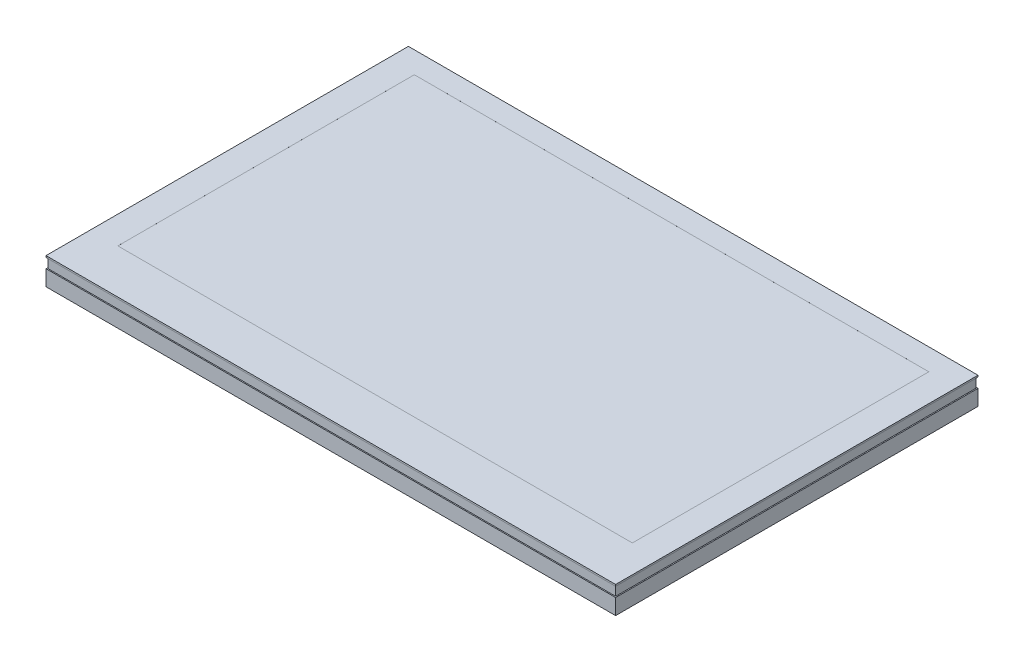
ISO-10303-21;
HEADER;
FILE_DESCRIPTION(('STEP AP214'),'2;1');
FILE_NAME('part.step','',(''),(''),'','','');
FILE_SCHEMA(('AUTOMOTIVE_DESIGN { 1 0 10303 214 1 1 1 1 }'));
ENDSEC;
DATA;
#1=APPLICATION_CONTEXT('core data for automotive mechanical design processes');
#2=APPLICATION_PROTOCOL_DEFINITION('international standard','automotive_design',2000,#1);
#3=PRODUCT_CONTEXT('',#1,'mechanical');
#4=PRODUCT('Part','Part','',(#3));
#5=PRODUCT_RELATED_PRODUCT_CATEGORY('part','',(#4));
#6=PRODUCT_DEFINITION_FORMATION('','',#4);
#7=PRODUCT_DEFINITION_CONTEXT('part definition',#1,'design');
#8=PRODUCT_DEFINITION('design','',#6,#7);
#9=PRODUCT_DEFINITION_SHAPE('','',#8);
#10=(LENGTH_UNIT() NAMED_UNIT(*) SI_UNIT(.MILLI.,.METRE.));
#11=(NAMED_UNIT(*) PLANE_ANGLE_UNIT() SI_UNIT($,.RADIAN.));
#12=(NAMED_UNIT(*) SI_UNIT($,.STERADIAN.) SOLID_ANGLE_UNIT());
#13=UNCERTAINTY_MEASURE_WITH_UNIT(LENGTH_MEASURE(1.E-05),#10,'distance_accuracy_value','');
#14=(GEOMETRIC_REPRESENTATION_CONTEXT(3) GLOBAL_UNCERTAINTY_ASSIGNED_CONTEXT((#13)) GLOBAL_UNIT_ASSIGNED_CONTEXT((#10,
#11,#12)) REPRESENTATION_CONTEXT('',''));
#15=CARTESIAN_POINT('',(0.,0.,0.));
#16=DIRECTION('',(0.,0.,1.));
#17=DIRECTION('',(1.,0.,0.));
#18=AXIS2_PLACEMENT_3D('',#15,#16,#17);
#19=CARTESIAN_POINT('',(0.,5.001,0.));
#20=DIRECTION('',(0.,1.,0.));
#21=DIRECTION('',(0.,0.,1.));
#22=AXIS2_PLACEMENT_3D('',#19,#20,#21);
#23=PLANE('',#22);
#24=DIRECTION('',(-1.,0.,0.));
#25=VECTOR('',#24,1.);
#26=CARTESIAN_POINT('',(52.71,5.001,-33.535));
#27=LINE('',#26,#25);
#28=CARTESIAN_POINT('',(52.71,5.001,-33.535));
#29=VERTEX_POINT('',#28);
#30=CARTESIAN_POINT('',(-52.71,5.001,-33.535));
#31=VERTEX_POINT('',#30);
#32=EDGE_CURVE('E153',#29,#31,#27,.T.);
#33=ORIENTED_EDGE('',*,*,#32,.T.);
#34=DIRECTION('',(0.,0.,1.));
#35=VECTOR('',#34,1.);
#36=CARTESIAN_POINT('',(-52.71,5.001,-33.535));
#37=LINE('',#36,#35);
#38=CARTESIAN_POINT('',(-52.71,5.001,33.535));
#39=VERTEX_POINT('',#38);
#40=EDGE_CURVE('E156',#31,#39,#37,.T.);
#41=ORIENTED_EDGE('',*,*,#40,.T.);
#42=DIRECTION('',(1.,0.,0.));
#43=VECTOR('',#42,1.);
#44=CARTESIAN_POINT('',(-52.71,5.001,33.535));
#45=LINE('',#44,#43);
#46=CARTESIAN_POINT('',(52.71,5.001,33.535));
#47=VERTEX_POINT('',#46);
#48=EDGE_CURVE('E159',#39,#47,#45,.T.);
#49=ORIENTED_EDGE('',*,*,#48,.T.);
#50=DIRECTION('',(0.,0.,-1.));
#51=VECTOR('',#50,1.);
#52=CARTESIAN_POINT('',(52.71,5.001,33.535));
#53=LINE('',#52,#51);
#54=EDGE_CURVE('E161',#47,#29,#53,.T.);
#55=ORIENTED_EDGE('',*,*,#54,.T.);
#56=EDGE_LOOP('',(#33,#41,#49,#55));
#57=FACE_BOUND('',#56,.T.);
#58=DIRECTION('',(0.,0.,1.));
#59=VECTOR('',#58,1.);
#60=CARTESIAN_POINT('',(-47.61,5.001,-29.535));
#61=LINE('',#60,#59);
#62=CARTESIAN_POINT('',(-47.61,5.001,-29.535));
#63=VERTEX_POINT('',#62);
#64=CARTESIAN_POINT('',(-47.61,5.001,25.335));
#65=VERTEX_POINT('',#64);
#66=EDGE_CURVE('E125',#63,#65,#61,.T.);
#67=ORIENTED_EDGE('',*,*,#66,.F.);
#68=DIRECTION('',(-1.,0.,0.));
#69=VECTOR('',#68,1.);
#70=CARTESIAN_POINT('',(47.61,5.001,-29.535));
#71=LINE('',#70,#69);
#72=CARTESIAN_POINT('',(47.61,5.001,-29.535));
#73=VERTEX_POINT('',#72);
#74=EDGE_CURVE('E117',#73,#63,#71,.T.);
#75=ORIENTED_EDGE('',*,*,#74,.F.);
#76=DIRECTION('',(0.,0.,-1.));
#77=VECTOR('',#76,1.);
#78=CARTESIAN_POINT('',(47.61,5.001,25.335));
#79=LINE('',#78,#77);
#80=CARTESIAN_POINT('',(47.61,5.001,25.335));
#81=VERTEX_POINT('',#80);
#82=EDGE_CURVE('E139',#81,#73,#79,.T.);
#83=ORIENTED_EDGE('',*,*,#82,.F.);
#84=DIRECTION('',(1.,0.,0.));
#85=VECTOR('',#84,1.);
#86=CARTESIAN_POINT('',(-47.61,5.001,25.335));
#87=LINE('',#86,#85);
#88=EDGE_CURVE('E137',#65,#81,#87,.T.);
#89=ORIENTED_EDGE('',*,*,#88,.F.);
#90=EDGE_LOOP('',(#67,#75,#83,#89));
#91=FACE_BOUND('',#90,.T.);
#92=ADVANCED_FACE('F52',(#57,#91),#23,.T.);
#93=CARTESIAN_POINT('',(0.,5.,0.));
#94=DIRECTION('',(0.,1.,0.));
#95=DIRECTION('',(0.,0.,1.));
#96=AXIS2_PLACEMENT_3D('',#93,#94,#95);
#97=PLANE('',#96);
#98=DIRECTION('',(-1.,0.,0.));
#99=VECTOR('',#98,1.);
#100=CARTESIAN_POINT('',(52.71,5.,-33.535));
#101=LINE('',#100,#99);
#102=CARTESIAN_POINT('',(52.71,5.,-33.535));
#103=VERTEX_POINT('',#102);
#104=CARTESIAN_POINT('',(-52.71,5.,-33.535));
#105=VERTEX_POINT('',#104);
#106=EDGE_CURVE('E133',#103,#105,#101,.T.);
#107=ORIENTED_EDGE('',*,*,#106,.F.);
#108=DIRECTION('',(0.,0.,-1.));
#109=VECTOR('',#108,1.);
#110=CARTESIAN_POINT('',(52.71,5.,33.535));
#111=LINE('',#110,#109);
#112=CARTESIAN_POINT('',(52.71,5.,33.535));
#113=VERTEX_POINT('',#112);
#114=EDGE_CURVE('E157',#113,#103,#111,.T.);
#115=ORIENTED_EDGE('',*,*,#114,.F.);
#116=DIRECTION('',(1.,0.,0.));
#117=VECTOR('',#116,1.);
#118=CARTESIAN_POINT('',(-52.71,5.,33.535));
#119=LINE('',#118,#117);
#120=CARTESIAN_POINT('',(-52.71,5.,33.535));
#121=VERTEX_POINT('',#120);
#122=EDGE_CURVE('E168',#121,#113,#119,.T.);
#123=ORIENTED_EDGE('',*,*,#122,.F.);
#124=DIRECTION('',(0.,0.,1.));
#125=VECTOR('',#124,1.);
#126=CARTESIAN_POINT('',(-52.71,5.,-33.535));
#127=LINE('',#126,#125);
#128=EDGE_CURVE('E166',#105,#121,#127,.T.);
#129=ORIENTED_EDGE('',*,*,#128,.F.);
#130=EDGE_LOOP('',(#107,#115,#123,#129));
#131=FACE_BOUND('',#130,.T.);
#132=DIRECTION('',(-1.,0.,0.));
#133=VECTOR('',#132,1.);
#134=CARTESIAN_POINT('',(47.61,5.,-29.535));
#135=LINE('',#134,#133);
#136=CARTESIAN_POINT('',(47.61,5.,-29.535));
#137=VERTEX_POINT('',#136);
#138=CARTESIAN_POINT('',(-47.61,5.,-29.535));
#139=VERTEX_POINT('',#138);
#140=EDGE_CURVE('E75',#137,#139,#135,.T.);
#141=ORIENTED_EDGE('',*,*,#140,.T.);
#142=DIRECTION('',(0.,0.,1.));
#143=VECTOR('',#142,1.);
#144=CARTESIAN_POINT('',(-47.61,5.,-29.535));
#145=LINE('',#144,#143);
#146=CARTESIAN_POINT('',(-47.61,5.,25.335));
#147=VERTEX_POINT('',#146);
#148=EDGE_CURVE('E132',#139,#147,#145,.T.);
#149=ORIENTED_EDGE('',*,*,#148,.T.);
#150=DIRECTION('',(1.,0.,0.));
#151=VECTOR('',#150,1.);
#152=CARTESIAN_POINT('',(-47.61,5.,25.335));
#153=LINE('',#152,#151);
#154=CARTESIAN_POINT('',(47.61,5.,25.335));
#155=VERTEX_POINT('',#154);
#156=EDGE_CURVE('E145',#147,#155,#153,.T.);
#157=ORIENTED_EDGE('',*,*,#156,.T.);
#158=DIRECTION('',(0.,0.,-1.));
#159=VECTOR('',#158,1.);
#160=CARTESIAN_POINT('',(47.61,5.,25.335));
#161=LINE('',#160,#159);
#162=EDGE_CURVE('E126',#155,#137,#161,.T.);
#163=ORIENTED_EDGE('',*,*,#162,.T.);
#164=EDGE_LOOP('',(#141,#149,#157,#163));
#165=FACE_BOUND('',#164,.T.);
#166=ADVANCED_FACE('F186',(#131,#165),#97,.F.);
#167=CARTESIAN_POINT('',(52.71,5.001,-33.535));
#168=DIRECTION('',(0.,0.,1.));
#169=DIRECTION('',(1.,0.,0.));
#170=AXIS2_PLACEMENT_3D('',#167,#168,#169);
#171=PLANE('',#170);
#172=ORIENTED_EDGE('',*,*,#106,.T.);
#173=DIRECTION('',(0.,-1.,0.));
#174=VECTOR('',#173,1.);
#175=CARTESIAN_POINT('',(-52.71,5.001,-33.535));
#176=LINE('',#175,#174);
#177=EDGE_CURVE('E12',#31,#105,#176,.T.);
#178=ORIENTED_EDGE('',*,*,#177,.F.);
#179=ORIENTED_EDGE('',*,*,#32,.F.);
#180=DIRECTION('',(0.,-1.,0.));
#181=VECTOR('',#180,1.);
#182=CARTESIAN_POINT('',(52.71,5.001,-33.535));
#183=LINE('',#182,#181);
#184=EDGE_CURVE('E163',#29,#103,#183,.T.);
#185=ORIENTED_EDGE('',*,*,#184,.T.);
#186=EDGE_LOOP('',(#172,#178,#179,#185));
#187=FACE_BOUND('',#186,.T.);
#188=ADVANCED_FACE('F54',(#187),#171,.F.);
#189=CARTESIAN_POINT('',(-52.71,5.001,-33.535));
#190=DIRECTION('',(1.,0.,0.));
#191=DIRECTION('',(0.,0.,-1.));
#192=AXIS2_PLACEMENT_3D('',#189,#190,#191);
#193=PLANE('',#192);
#194=ORIENTED_EDGE('',*,*,#128,.T.);
#195=DIRECTION('',(0.,-1.,0.));
#196=VECTOR('',#195,1.);
#197=CARTESIAN_POINT('',(-52.71,5.001,33.535));
#198=LINE('',#197,#196);
#199=EDGE_CURVE('E60',#39,#121,#198,.T.);
#200=ORIENTED_EDGE('',*,*,#199,.F.);
#201=ORIENTED_EDGE('',*,*,#40,.F.);
#202=ORIENTED_EDGE('',*,*,#177,.T.);
#203=EDGE_LOOP('',(#194,#200,#201,#202));
#204=FACE_BOUND('',#203,.T.);
#205=ADVANCED_FACE('F196',(#204),#193,.F.);
#206=CARTESIAN_POINT('',(-52.71,5.001,33.535));
#207=DIRECTION('',(0.,0.,-1.));
#208=DIRECTION('',(-1.,0.,0.));
#209=AXIS2_PLACEMENT_3D('',#206,#207,#208);
#210=PLANE('',#209);
#211=ORIENTED_EDGE('',*,*,#122,.T.);
#212=DIRECTION('',(0.,-1.,0.));
#213=VECTOR('',#212,1.);
#214=CARTESIAN_POINT('',(52.71,5.001,33.535));
#215=LINE('',#214,#213);
#216=EDGE_CURVE('E173',#47,#113,#215,.T.);
#217=ORIENTED_EDGE('',*,*,#216,.F.);
#218=ORIENTED_EDGE('',*,*,#48,.F.);
#219=ORIENTED_EDGE('',*,*,#199,.T.);
#220=EDGE_LOOP('',(#211,#217,#218,#219));
#221=FACE_BOUND('',#220,.T.);
#222=ADVANCED_FACE('F180',(#221),#210,.F.);
#223=CARTESIAN_POINT('',(52.71,5.001,33.535));
#224=DIRECTION('',(-1.,0.,0.));
#225=DIRECTION('',(0.,0.,1.));
#226=AXIS2_PLACEMENT_3D('',#223,#224,#225);
#227=PLANE('',#226);
#228=ORIENTED_EDGE('',*,*,#114,.T.);
#229=ORIENTED_EDGE('',*,*,#184,.F.);
#230=ORIENTED_EDGE('',*,*,#54,.F.);
#231=ORIENTED_EDGE('',*,*,#216,.T.);
#232=EDGE_LOOP('',(#228,#229,#230,#231));
#233=FACE_BOUND('',#232,.T.);
#234=ADVANCED_FACE('F190',(#233),#227,.F.);
#235=CARTESIAN_POINT('',(47.61,5.001,-29.535));
#236=DIRECTION('',(0.,0.,1.));
#237=DIRECTION('',(1.,0.,0.));
#238=AXIS2_PLACEMENT_3D('',#235,#236,#237);
#239=PLANE('',#238);
#240=ORIENTED_EDGE('',*,*,#140,.F.);
#241=DIRECTION('',(0.,-1.,0.));
#242=VECTOR('',#241,1.);
#243=CARTESIAN_POINT('',(47.61,5.001,-29.535));
#244=LINE('',#243,#242);
#245=EDGE_CURVE('E121',#73,#137,#244,.T.);
#246=ORIENTED_EDGE('',*,*,#245,.F.);
#247=ORIENTED_EDGE('',*,*,#74,.T.);
#248=DIRECTION('',(0.,-1.,0.));
#249=VECTOR('',#248,1.);
#250=CARTESIAN_POINT('',(-47.61,5.001,-29.535));
#251=LINE('',#250,#249);
#252=EDGE_CURVE('E120',#63,#139,#251,.T.);
#253=ORIENTED_EDGE('',*,*,#252,.T.);
#254=EDGE_LOOP('',(#240,#246,#247,#253));
#255=FACE_BOUND('',#254,.T.);
#256=ADVANCED_FACE('F119',(#255),#239,.T.);
#257=CARTESIAN_POINT('',(-47.61,5.001,-29.535));
#258=DIRECTION('',(1.,0.,0.));
#259=DIRECTION('',(0.,0.,-1.));
#260=AXIS2_PLACEMENT_3D('',#257,#258,#259);
#261=PLANE('',#260);
#262=ORIENTED_EDGE('',*,*,#148,.F.);
#263=ORIENTED_EDGE('',*,*,#252,.F.);
#264=ORIENTED_EDGE('',*,*,#66,.T.);
#265=DIRECTION('',(0.,-1.,0.));
#266=VECTOR('',#265,1.);
#267=CARTESIAN_POINT('',(-47.61,5.001,25.335));
#268=LINE('',#267,#266);
#269=EDGE_CURVE('E134',#65,#147,#268,.T.);
#270=ORIENTED_EDGE('',*,*,#269,.T.);
#271=EDGE_LOOP('',(#262,#263,#264,#270));
#272=FACE_BOUND('',#271,.T.);
#273=ADVANCED_FACE('F129',(#272),#261,.T.);
#274=CARTESIAN_POINT('',(-47.61,5.001,25.335));
#275=DIRECTION('',(0.,0.,-1.));
#276=DIRECTION('',(-1.,0.,0.));
#277=AXIS2_PLACEMENT_3D('',#274,#275,#276);
#278=PLANE('',#277);
#279=ORIENTED_EDGE('',*,*,#156,.F.);
#280=ORIENTED_EDGE('',*,*,#269,.F.);
#281=ORIENTED_EDGE('',*,*,#88,.T.);
#282=DIRECTION('',(0.,-1.,0.));
#283=VECTOR('',#282,1.);
#284=CARTESIAN_POINT('',(47.61,5.001,25.335));
#285=LINE('',#284,#283);
#286=EDGE_CURVE('E67',#81,#155,#285,.T.);
#287=ORIENTED_EDGE('',*,*,#286,.T.);
#288=EDGE_LOOP('',(#279,#280,#281,#287));
#289=FACE_BOUND('',#288,.T.);
#290=ADVANCED_FACE('F219',(#289),#278,.T.);
#291=CARTESIAN_POINT('',(47.61,5.001,25.335));
#292=DIRECTION('',(-1.,0.,0.));
#293=DIRECTION('',(0.,0.,1.));
#294=AXIS2_PLACEMENT_3D('',#291,#292,#293);
#295=PLANE('',#294);
#296=ORIENTED_EDGE('',*,*,#162,.F.);
#297=ORIENTED_EDGE('',*,*,#286,.F.);
#298=ORIENTED_EDGE('',*,*,#82,.T.);
#299=ORIENTED_EDGE('',*,*,#245,.T.);
#300=EDGE_LOOP('',(#296,#297,#298,#299));
#301=FACE_BOUND('',#300,.T.);
#302=ADVANCED_FACE('F223',(#301),#295,.T.);
#303=CLOSED_SHELL('',(#92,#166,#188,#205,#222,#234,#256,#273,#290,#302));
#304=MANIFOLD_SOLID_BREP('B2',#303);
#305=CARTESIAN_POINT('',(52.71,5.,33.535));
#306=DIRECTION('',(-1.,0.,0.));
#307=DIRECTION('',(0.,0.,1.));
#308=AXIS2_PLACEMENT_3D('',#305,#306,#307);
#309=PLANE('',#308);
#310=DIRECTION('',(0.,0.,-1.));
#311=VECTOR('',#310,1.);
#312=CARTESIAN_POINT('',(52.71,4.7,33.535));
#313=LINE('',#312,#311);
#314=CARTESIAN_POINT('',(52.71,4.7,33.535));
#315=VERTEX_POINT('',#314);
#316=CARTESIAN_POINT('',(52.71,4.7,-33.535));
#317=VERTEX_POINT('',#316);
#318=EDGE_CURVE('E357',#315,#317,#313,.T.);
#319=ORIENTED_EDGE('',*,*,#318,.T.);
#320=DIRECTION('',(0.,-1.,0.));
#321=VECTOR('',#320,1.);
#322=CARTESIAN_POINT('',(52.71,5.,-33.535));
#323=LINE('',#322,#321);
#324=CARTESIAN_POINT('',(52.71,5.,-33.535));
#325=VERTEX_POINT('',#324);
#326=EDGE_CURVE('E50',#325,#317,#323,.T.);
#327=ORIENTED_EDGE('',*,*,#326,.F.);
#328=DIRECTION('',(0.,0.,-1.));
#329=VECTOR('',#328,1.);
#330=CARTESIAN_POINT('',(52.71,5.,33.535));
#331=LINE('',#330,#329);
#332=CARTESIAN_POINT('',(52.71,5.,33.535));
#333=VERTEX_POINT('',#332);
#334=EDGE_CURVE('E345',#333,#325,#331,.T.);
#335=ORIENTED_EDGE('',*,*,#334,.F.);
#336=DIRECTION('',(0.,-1.,0.));
#337=VECTOR('',#336,1.);
#338=CARTESIAN_POINT('',(52.71,5.,33.535));
#339=LINE('',#338,#337);
#340=EDGE_CURVE('E353',#333,#315,#339,.T.);
#341=ORIENTED_EDGE('',*,*,#340,.T.);
#342=EDGE_LOOP('',(#319,#327,#335,#341));
#343=FACE_BOUND('',#342,.T.);
#344=ADVANCED_FACE('F294',(#343),#309,.F.);
#345=CARTESIAN_POINT('',(-52.71,5.,-33.535));
#346=DIRECTION('',(0.,0.,1.));
#347=DIRECTION('',(1.,0.,0.));
#348=AXIS2_PLACEMENT_3D('',#345,#346,#347);
#349=PLANE('',#348);
#350=DIRECTION('',(-1.,0.,0.));
#351=VECTOR('',#350,1.);
#352=CARTESIAN_POINT('',(-52.71,4.7,-33.535));
#353=LINE('',#352,#351);
#354=CARTESIAN_POINT('',(-52.71,4.7,-33.535));
#355=VERTEX_POINT('',#354);
#356=EDGE_CURVE('E349',#317,#355,#353,.T.);
#357=ORIENTED_EDGE('',*,*,#356,.T.);
#358=DIRECTION('',(0.,-1.,0.));
#359=VECTOR('',#358,1.);
#360=CARTESIAN_POINT('',(-52.71,5.,-33.535));
#361=LINE('',#360,#359);
#362=CARTESIAN_POINT('',(-52.71,5.,-33.535));
#363=VERTEX_POINT('',#362);
#364=EDGE_CURVE('E302',#363,#355,#361,.T.);
#365=ORIENTED_EDGE('',*,*,#364,.F.);
#366=DIRECTION('',(-1.,0.,0.));
#367=VECTOR('',#366,1.);
#368=CARTESIAN_POINT('',(-52.71,5.,-33.535));
#369=LINE('',#368,#367);
#370=EDGE_CURVE('E340',#325,#363,#369,.T.);
#371=ORIENTED_EDGE('',*,*,#370,.F.);
#372=ORIENTED_EDGE('',*,*,#326,.T.);
#373=EDGE_LOOP('',(#357,#365,#371,#372));
#374=FACE_BOUND('',#373,.T.);
#375=ADVANCED_FACE('F348',(#374),#349,.F.);
#376=CARTESIAN_POINT('',(-52.71,5.,33.535));
#377=DIRECTION('',(1.,0.,0.));
#378=DIRECTION('',(0.,0.,-1.));
#379=AXIS2_PLACEMENT_3D('',#376,#377,#378);
#380=PLANE('',#379);
#381=DIRECTION('',(0.,0.,1.));
#382=VECTOR('',#381,1.);
#383=CARTESIAN_POINT('',(-52.71,4.7,33.535));
#384=LINE('',#383,#382);
#385=CARTESIAN_POINT('',(-52.71,4.7,33.535));
#386=VERTEX_POINT('',#385);
#387=EDGE_CURVE('E327',#355,#386,#384,.T.);
#388=ORIENTED_EDGE('',*,*,#387,.T.);
#389=DIRECTION('',(0.,-1.,0.));
#390=VECTOR('',#389,1.);
#391=CARTESIAN_POINT('',(-52.71,5.,33.535));
#392=LINE('',#391,#390);
#393=CARTESIAN_POINT('',(-52.71,5.,33.535));
#394=VERTEX_POINT('',#393);
#395=EDGE_CURVE('E350',#394,#386,#392,.T.);
#396=ORIENTED_EDGE('',*,*,#395,.F.);
#397=DIRECTION('',(0.,0.,1.));
#398=VECTOR('',#397,1.);
#399=CARTESIAN_POINT('',(-52.71,5.,33.535));
#400=LINE('',#399,#398);
#401=EDGE_CURVE('E343',#363,#394,#400,.T.);
#402=ORIENTED_EDGE('',*,*,#401,.F.);
#403=ORIENTED_EDGE('',*,*,#364,.T.);
#404=EDGE_LOOP('',(#388,#396,#402,#403));
#405=FACE_BOUND('',#404,.T.);
#406=ADVANCED_FACE('F351',(#405),#380,.F.);
#407=CARTESIAN_POINT('',(-52.71,5.,33.535));
#408=DIRECTION('',(0.,0.,-1.));
#409=DIRECTION('',(-1.,0.,0.));
#410=AXIS2_PLACEMENT_3D('',#407,#408,#409);
#411=PLANE('',#410);
#412=DIRECTION('',(1.,0.,0.));
#413=VECTOR('',#412,1.);
#414=CARTESIAN_POINT('',(-52.71,4.7,33.535));
#415=LINE('',#414,#413);
#416=EDGE_CURVE('E333',#386,#315,#415,.T.);
#417=ORIENTED_EDGE('',*,*,#416,.T.);
#418=ORIENTED_EDGE('',*,*,#340,.F.);
#419=DIRECTION('',(1.,0.,0.));
#420=VECTOR('',#419,1.);
#421=CARTESIAN_POINT('',(-52.71,5.,33.535));
#422=LINE('',#421,#420);
#423=EDGE_CURVE('E310',#394,#333,#422,.T.);
#424=ORIENTED_EDGE('',*,*,#423,.F.);
#425=ORIENTED_EDGE('',*,*,#395,.T.);
#426=EDGE_LOOP('',(#417,#418,#424,#425));
#427=FACE_BOUND('',#426,.T.);
#428=ADVANCED_FACE('F364',(#427),#411,.F.);
#429=CARTESIAN_POINT('',(0.,5.,0.));
#430=DIRECTION('',(0.,-1.,0.));
#431=DIRECTION('',(0.,0.,-1.));
#432=AXIS2_PLACEMENT_3D('',#429,#430,#431);
#433=PLANE('',#432);
#434=ORIENTED_EDGE('',*,*,#334,.T.);
#435=ORIENTED_EDGE('',*,*,#370,.T.);
#436=ORIENTED_EDGE('',*,*,#401,.T.);
#437=ORIENTED_EDGE('',*,*,#423,.T.);
#438=EDGE_LOOP('',(#434,#435,#436,#437));
#439=FACE_BOUND('',#438,.T.);
#440=ADVANCED_FACE('F341',(#439),#433,.F.);
#441=CARTESIAN_POINT('',(0.,4.7,0.));
#442=DIRECTION('',(0.,-1.,0.));
#443=DIRECTION('',(0.,0.,-1.));
#444=AXIS2_PLACEMENT_3D('',#441,#442,#443);
#445=PLANE('',#444);
#446=ORIENTED_EDGE('',*,*,#318,.F.);
#447=ORIENTED_EDGE('',*,*,#416,.F.);
#448=ORIENTED_EDGE('',*,*,#387,.F.);
#449=ORIENTED_EDGE('',*,*,#356,.F.);
#450=EDGE_LOOP('',(#446,#447,#448,#449));
#451=FACE_BOUND('',#450,.T.);
#452=ADVANCED_FACE('F367',(#451),#445,.T.);
#453=CLOSED_SHELL('',(#344,#375,#406,#428,#440,#452));
#454=MANIFOLD_SOLID_BREP('B6',#453);
#455=CARTESIAN_POINT('',(-52.51,4.7,33.335));
#456=DIRECTION('',(1.,0.,0.));
#457=DIRECTION('',(0.,0.,-1.));
#458=AXIS2_PLACEMENT_3D('',#455,#456,#457);
#459=PLANE('',#458);
#460=DIRECTION('',(0.,0.,1.));
#461=VECTOR('',#460,1.);
#462=CARTESIAN_POINT('',(-52.51,2.9,33.335));
#463=LINE('',#462,#461);
#464=CARTESIAN_POINT('',(-52.51,2.9,-33.335));
#465=VERTEX_POINT('',#464);
#466=CARTESIAN_POINT('',(-52.51,2.9,33.335));
#467=VERTEX_POINT('',#466);
#468=EDGE_CURVE('E500',#465,#467,#463,.T.);
#469=ORIENTED_EDGE('',*,*,#468,.T.);
#470=DIRECTION('',(0.,-1.,0.));
#471=VECTOR('',#470,1.);
#472=CARTESIAN_POINT('',(-52.51,4.7,33.335));
#473=LINE('',#472,#471);
#474=CARTESIAN_POINT('',(-52.51,4.7,33.335));
#475=VERTEX_POINT('',#474);
#476=EDGE_CURVE('E292',#475,#467,#473,.T.);
#477=ORIENTED_EDGE('',*,*,#476,.F.);
#478=DIRECTION('',(0.,0.,1.));
#479=VECTOR('',#478,1.);
#480=CARTESIAN_POINT('',(-52.51,4.7,33.335));
#481=LINE('',#480,#479);
#482=CARTESIAN_POINT('',(-52.51,4.7,-33.335));
#483=VERTEX_POINT('',#482);
#484=EDGE_CURVE('E488',#483,#475,#481,.T.);
#485=ORIENTED_EDGE('',*,*,#484,.F.);
#486=DIRECTION('',(0.,-1.,0.));
#487=VECTOR('',#486,1.);
#488=CARTESIAN_POINT('',(-52.51,4.7,-33.335));
#489=LINE('',#488,#487);
#490=EDGE_CURVE('E496',#483,#465,#489,.T.);
#491=ORIENTED_EDGE('',*,*,#490,.T.);
#492=EDGE_LOOP('',(#469,#477,#485,#491));
#493=FACE_BOUND('',#492,.T.);
#494=ADVANCED_FACE('F437',(#493),#459,.F.);
#495=CARTESIAN_POINT('',(-52.51,4.7,33.335));
#496=DIRECTION('',(0.,0.,-1.));
#497=DIRECTION('',(-1.,0.,0.));
#498=AXIS2_PLACEMENT_3D('',#495,#496,#497);
#499=PLANE('',#498);
#500=DIRECTION('',(1.,0.,0.));
#501=VECTOR('',#500,1.);
#502=CARTESIAN_POINT('',(-52.51,2.9,33.335));
#503=LINE('',#502,#501);
#504=CARTESIAN_POINT('',(52.51,2.9,33.335));
#505=VERTEX_POINT('',#504);
#506=EDGE_CURVE('E492',#467,#505,#503,.T.);
#507=ORIENTED_EDGE('',*,*,#506,.T.);
#508=DIRECTION('',(0.,-1.,0.));
#509=VECTOR('',#508,1.);
#510=CARTESIAN_POINT('',(52.51,4.7,33.335));
#511=LINE('',#510,#509);
#512=CARTESIAN_POINT('',(52.51,4.7,33.335));
#513=VERTEX_POINT('',#512);
#514=EDGE_CURVE('E445',#513,#505,#511,.T.);
#515=ORIENTED_EDGE('',*,*,#514,.F.);
#516=DIRECTION('',(1.,0.,0.));
#517=VECTOR('',#516,1.);
#518=CARTESIAN_POINT('',(-52.51,4.7,33.335));
#519=LINE('',#518,#517);
#520=EDGE_CURVE('E483',#475,#513,#519,.T.);
#521=ORIENTED_EDGE('',*,*,#520,.F.);
#522=ORIENTED_EDGE('',*,*,#476,.T.);
#523=EDGE_LOOP('',(#507,#515,#521,#522));
#524=FACE_BOUND('',#523,.T.);
#525=ADVANCED_FACE('F491',(#524),#499,.F.);
#526=CARTESIAN_POINT('',(52.51,4.7,33.335));
#527=DIRECTION('',(-1.,0.,0.));
#528=DIRECTION('',(0.,0.,1.));
#529=AXIS2_PLACEMENT_3D('',#526,#527,#528);
#530=PLANE('',#529);
#531=DIRECTION('',(0.,0.,-1.));
#532=VECTOR('',#531,1.);
#533=CARTESIAN_POINT('',(52.51,2.9,33.335));
#534=LINE('',#533,#532);
#535=CARTESIAN_POINT('',(52.51,2.9,-33.335));
#536=VERTEX_POINT('',#535);
#537=EDGE_CURVE('E470',#505,#536,#534,.T.);
#538=ORIENTED_EDGE('',*,*,#537,.T.);
#539=DIRECTION('',(0.,-1.,0.));
#540=VECTOR('',#539,1.);
#541=CARTESIAN_POINT('',(52.51,4.7,-33.335));
#542=LINE('',#541,#540);
#543=CARTESIAN_POINT('',(52.51,4.7,-33.335));
#544=VERTEX_POINT('',#543);
#545=EDGE_CURVE('E493',#544,#536,#542,.T.);
#546=ORIENTED_EDGE('',*,*,#545,.F.);
#547=DIRECTION('',(0.,0.,-1.));
#548=VECTOR('',#547,1.);
#549=CARTESIAN_POINT('',(52.51,4.7,33.335));
#550=LINE('',#549,#548);
#551=EDGE_CURVE('E486',#513,#544,#550,.T.);
#552=ORIENTED_EDGE('',*,*,#551,.F.);
#553=ORIENTED_EDGE('',*,*,#514,.T.);
#554=EDGE_LOOP('',(#538,#546,#552,#553));
#555=FACE_BOUND('',#554,.T.);
#556=ADVANCED_FACE('F494',(#555),#530,.F.);
#557=CARTESIAN_POINT('',(-52.51,4.7,-33.335));
#558=DIRECTION('',(0.,0.,1.));
#559=DIRECTION('',(1.,0.,0.));
#560=AXIS2_PLACEMENT_3D('',#557,#558,#559);
#561=PLANE('',#560);
#562=DIRECTION('',(-1.,0.,0.));
#563=VECTOR('',#562,1.);
#564=CARTESIAN_POINT('',(-52.51,2.9,-33.335));
#565=LINE('',#564,#563);
#566=EDGE_CURVE('E476',#536,#465,#565,.T.);
#567=ORIENTED_EDGE('',*,*,#566,.T.);
#568=ORIENTED_EDGE('',*,*,#490,.F.);
#569=DIRECTION('',(-1.,0.,0.));
#570=VECTOR('',#569,1.);
#571=CARTESIAN_POINT('',(-52.51,4.7,-33.335));
#572=LINE('',#571,#570);
#573=EDGE_CURVE('E453',#544,#483,#572,.T.);
#574=ORIENTED_EDGE('',*,*,#573,.F.);
#575=ORIENTED_EDGE('',*,*,#545,.T.);
#576=EDGE_LOOP('',(#567,#568,#574,#575));
#577=FACE_BOUND('',#576,.T.);
#578=ADVANCED_FACE('F507',(#577),#561,.F.);
#579=CARTESIAN_POINT('',(0.,4.7,0.));
#580=DIRECTION('',(0.,-1.,0.));
#581=DIRECTION('',(0.,0.,-1.));
#582=AXIS2_PLACEMENT_3D('',#579,#580,#581);
#583=PLANE('',#582);
#584=ORIENTED_EDGE('',*,*,#484,.T.);
#585=ORIENTED_EDGE('',*,*,#520,.T.);
#586=ORIENTED_EDGE('',*,*,#551,.T.);
#587=ORIENTED_EDGE('',*,*,#573,.T.);
#588=EDGE_LOOP('',(#584,#585,#586,#587));
#589=FACE_BOUND('',#588,.T.);
#590=ADVANCED_FACE('F484',(#589),#583,.F.);
#591=CARTESIAN_POINT('',(0.,2.9,0.));
#592=DIRECTION('',(0.,-1.,0.));
#593=DIRECTION('',(0.,0.,-1.));
#594=AXIS2_PLACEMENT_3D('',#591,#592,#593);
#595=PLANE('',#594);
#596=ORIENTED_EDGE('',*,*,#468,.F.);
#597=ORIENTED_EDGE('',*,*,#566,.F.);
#598=ORIENTED_EDGE('',*,*,#537,.F.);
#599=ORIENTED_EDGE('',*,*,#506,.F.);
#600=EDGE_LOOP('',(#596,#597,#598,#599));
#601=FACE_BOUND('',#600,.T.);
#602=ADVANCED_FACE('F510',(#601),#595,.T.);
#603=CLOSED_SHELL('',(#494,#525,#556,#578,#590,#602));
#604=MANIFOLD_SOLID_BREP('B44',#603);
#605=CARTESIAN_POINT('',(52.71,2.9,33.535));
#606=DIRECTION('',(-1.,0.,0.));
#607=DIRECTION('',(0.,0.,1.));
#608=AXIS2_PLACEMENT_3D('',#605,#606,#607);
#609=PLANE('',#608);
#610=DIRECTION('',(0.,0.,-1.));
#611=VECTOR('',#610,1.);
#612=CARTESIAN_POINT('',(52.71,0.,33.535));
#613=LINE('',#612,#611);
#614=CARTESIAN_POINT('',(52.71,0.,33.535));
#615=VERTEX_POINT('',#614);
#616=CARTESIAN_POINT('',(52.71,0.,-33.535));
#617=VERTEX_POINT('',#616);
#618=EDGE_CURVE('E637',#615,#617,#613,.T.);
#619=ORIENTED_EDGE('',*,*,#618,.T.);
#620=DIRECTION('',(0.,-1.,0.));
#621=VECTOR('',#620,1.);
#622=CARTESIAN_POINT('',(52.71,2.9,-33.535));
#623=LINE('',#622,#621);
#624=CARTESIAN_POINT('',(52.71,2.9,-33.535));
#625=VERTEX_POINT('',#624);
#626=EDGE_CURVE('E435',#625,#617,#623,.T.);
#627=ORIENTED_EDGE('',*,*,#626,.F.);
#628=DIRECTION('',(0.,0.,-1.));
#629=VECTOR('',#628,1.);
#630=CARTESIAN_POINT('',(52.71,2.9,33.535));
#631=LINE('',#630,#629);
#632=CARTESIAN_POINT('',(52.71,2.9,33.535));
#633=VERTEX_POINT('',#632);
#634=EDGE_CURVE('E621',#633,#625,#631,.T.);
#635=ORIENTED_EDGE('',*,*,#634,.F.);
#636=DIRECTION('',(0.,-1.,0.));
#637=VECTOR('',#636,1.);
#638=CARTESIAN_POINT('',(52.71,2.9,33.535));
#639=LINE('',#638,#637);
#640=EDGE_CURVE('E633',#633,#615,#639,.T.);
#641=ORIENTED_EDGE('',*,*,#640,.T.);
#642=EDGE_LOOP('',(#619,#627,#635,#641));
#643=FACE_BOUND('',#642,.T.);
#644=ADVANCED_FACE('F569',(#643),#609,.F.);
#645=CARTESIAN_POINT('',(-52.71,2.9,-33.535));
#646=DIRECTION('',(0.,0.,1.));
#647=DIRECTION('',(1.,0.,0.));
#648=AXIS2_PLACEMENT_3D('',#645,#646,#647);
#649=PLANE('',#648);
#650=DIRECTION('',(-1.,0.,0.));
#651=VECTOR('',#650,1.);
#652=CARTESIAN_POINT('',(-52.71,0.,-33.535));
#653=LINE('',#652,#651);
#654=CARTESIAN_POINT('',(-52.71,0.,-33.535));
#655=VERTEX_POINT('',#654);
#656=EDGE_CURVE('E626',#617,#655,#653,.T.);
#657=ORIENTED_EDGE('',*,*,#656,.T.);
#658=DIRECTION('',(0.,-1.,0.));
#659=VECTOR('',#658,1.);
#660=CARTESIAN_POINT('',(-52.71,2.9,-33.535));
#661=LINE('',#660,#659);
#662=CARTESIAN_POINT('',(-52.71,2.9,-33.535));
#663=VERTEX_POINT('',#662);
#664=EDGE_CURVE('E578',#663,#655,#661,.T.);
#665=ORIENTED_EDGE('',*,*,#664,.F.);
#666=DIRECTION('',(-1.,0.,0.));
#667=VECTOR('',#666,1.);
#668=CARTESIAN_POINT('',(-52.71,2.9,-33.535));
#669=LINE('',#668,#667);
#670=EDGE_CURVE('E616',#625,#663,#669,.T.);
#671=ORIENTED_EDGE('',*,*,#670,.F.);
#672=ORIENTED_EDGE('',*,*,#626,.T.);
#673=EDGE_LOOP('',(#657,#665,#671,#672));
#674=FACE_BOUND('',#673,.T.);
#675=ADVANCED_FACE('F625',(#674),#649,.F.);
#676=CARTESIAN_POINT('',(-52.71,2.9,33.535));
#677=DIRECTION('',(1.,0.,0.));
#678=DIRECTION('',(0.,0.,-1.));
#679=AXIS2_PLACEMENT_3D('',#676,#677,#678);
#680=PLANE('',#679);
#681=DIRECTION('',(0.,0.,1.));
#682=VECTOR('',#681,1.);
#683=CARTESIAN_POINT('',(-52.71,0.,33.535));
#684=LINE('',#683,#682);
#685=CARTESIAN_POINT('',(-52.71,0.,33.535));
#686=VERTEX_POINT('',#685);
#687=EDGE_CURVE('E603',#655,#686,#684,.T.);
#688=ORIENTED_EDGE('',*,*,#687,.T.);
#689=DIRECTION('',(0.,-1.,0.));
#690=VECTOR('',#689,1.);
#691=CARTESIAN_POINT('',(-52.71,2.9,33.535));
#692=LINE('',#691,#690);
#693=CARTESIAN_POINT('',(-52.71,2.9,33.535));
#694=VERTEX_POINT('',#693);
#695=EDGE_CURVE('E628',#694,#686,#692,.T.);
#696=ORIENTED_EDGE('',*,*,#695,.F.);
#697=DIRECTION('',(0.,0.,1.));
#698=VECTOR('',#697,1.);
#699=CARTESIAN_POINT('',(-52.71,2.9,33.535));
#700=LINE('',#699,#698);
#701=EDGE_CURVE('E619',#663,#694,#700,.T.);
#702=ORIENTED_EDGE('',*,*,#701,.F.);
#703=ORIENTED_EDGE('',*,*,#664,.T.);
#704=EDGE_LOOP('',(#688,#696,#702,#703));
#705=FACE_BOUND('',#704,.T.);
#706=ADVANCED_FACE('F629',(#705),#680,.F.);
#707=CARTESIAN_POINT('',(-52.71,2.9,33.535));
#708=DIRECTION('',(0.,0.,-1.));
#709=DIRECTION('',(-1.,0.,0.));
#710=AXIS2_PLACEMENT_3D('',#707,#708,#709);
#711=PLANE('',#710);
#712=DIRECTION('',(1.,0.,0.));
#713=VECTOR('',#712,1.);
#714=CARTESIAN_POINT('',(-52.71,0.,33.535));
#715=LINE('',#714,#713);
#716=EDGE_CURVE('E609',#686,#615,#715,.T.);
#717=ORIENTED_EDGE('',*,*,#716,.T.);
#718=ORIENTED_EDGE('',*,*,#640,.F.);
#719=DIRECTION('',(1.,0.,0.));
#720=VECTOR('',#719,1.);
#721=CARTESIAN_POINT('',(-52.71,2.9,33.535));
#722=LINE('',#721,#720);
#723=EDGE_CURVE('E586',#694,#633,#722,.T.);
#724=ORIENTED_EDGE('',*,*,#723,.F.);
#725=ORIENTED_EDGE('',*,*,#695,.T.);
#726=EDGE_LOOP('',(#717,#718,#724,#725));
#727=FACE_BOUND('',#726,.T.);
#728=ADVANCED_FACE('F650',(#727),#711,.F.);
#729=CARTESIAN_POINT('',(0.,2.9,0.));
#730=DIRECTION('',(0.,-1.,0.));
#731=DIRECTION('',(0.,0.,-1.));
#732=AXIS2_PLACEMENT_3D('',#729,#730,#731);
#733=PLANE('',#732);
#734=ORIENTED_EDGE('',*,*,#634,.T.);
#735=ORIENTED_EDGE('',*,*,#670,.T.);
#736=ORIENTED_EDGE('',*,*,#701,.T.);
#737=ORIENTED_EDGE('',*,*,#723,.T.);
#738=EDGE_LOOP('',(#734,#735,#736,#737));
#739=FACE_BOUND('',#738,.T.);
#740=ADVANCED_FACE('F617',(#739),#733,.F.);
#741=CARTESIAN_POINT('',(0.,0.,0.));
#742=DIRECTION('',(0.,-1.,0.));
#743=DIRECTION('',(0.,0.,-1.));
#744=AXIS2_PLACEMENT_3D('',#741,#742,#743);
#745=PLANE('',#744);
#746=ORIENTED_EDGE('',*,*,#618,.F.);
#747=ORIENTED_EDGE('',*,*,#716,.F.);
#748=ORIENTED_EDGE('',*,*,#687,.F.);
#749=ORIENTED_EDGE('',*,*,#656,.F.);
#750=EDGE_LOOP('',(#746,#747,#748,#749));
#751=FACE_BOUND('',#750,.T.);
#752=ADVANCED_FACE('F653',(#751),#745,.T.);
#753=CLOSED_SHELL('',(#644,#675,#706,#728,#740,#752));
#754=MANIFOLD_SOLID_BREP('B286',#753);
#755=ADVANCED_BREP_SHAPE_REPRESENTATION('',(#18,#304,#454,#604,#754),#14);
#756=SHAPE_DEFINITION_REPRESENTATION(#9,#755);
ENDSEC;
END-ISO-10303-21;
